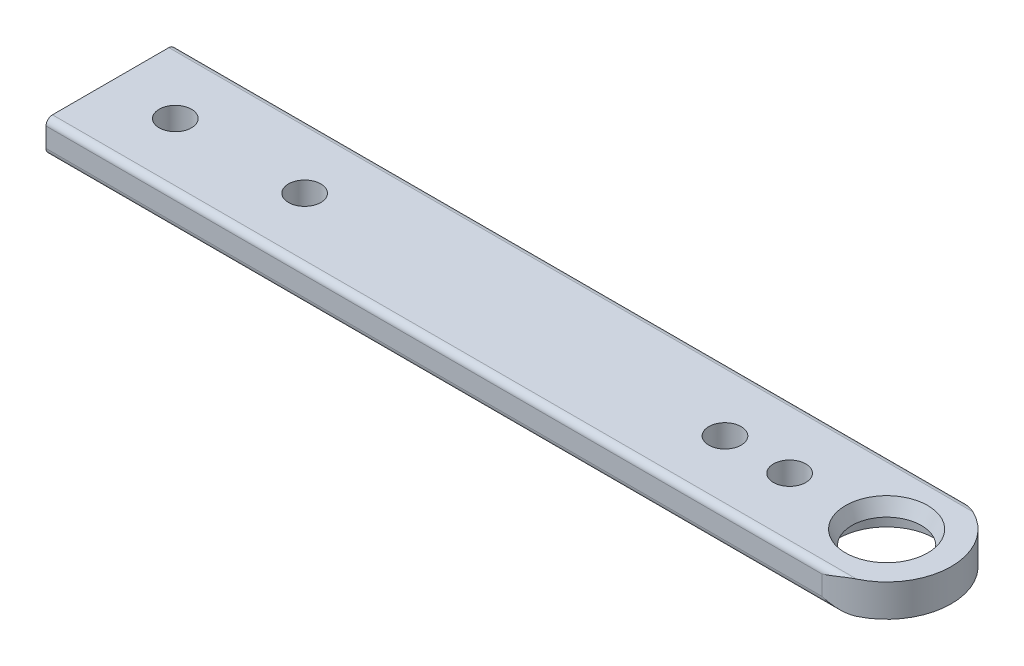
ISO-10303-21;
HEADER;
FILE_DESCRIPTION(('STEP AP214'),'2;1');
FILE_NAME('part.step','',(''),(''),'','','');
FILE_SCHEMA(('AUTOMOTIVE_DESIGN { 1 0 10303 214 1 1 1 1 }'));
ENDSEC;
DATA;
#1=APPLICATION_CONTEXT('core data for automotive mechanical design processes');
#2=APPLICATION_PROTOCOL_DEFINITION('international standard','automotive_design',2000,#1);
#3=PRODUCT_CONTEXT('',#1,'mechanical');
#4=PRODUCT('Part','Part','',(#3));
#5=PRODUCT_RELATED_PRODUCT_CATEGORY('part','',(#4));
#6=PRODUCT_DEFINITION_FORMATION('','',#4);
#7=PRODUCT_DEFINITION_CONTEXT('part definition',#1,'design');
#8=PRODUCT_DEFINITION('design','',#6,#7);
#9=PRODUCT_DEFINITION_SHAPE('','',#8);
#10=(LENGTH_UNIT() NAMED_UNIT(*) SI_UNIT(.MILLI.,.METRE.));
#11=(NAMED_UNIT(*) PLANE_ANGLE_UNIT() SI_UNIT($,.RADIAN.));
#12=(NAMED_UNIT(*) SI_UNIT($,.STERADIAN.) SOLID_ANGLE_UNIT());
#13=UNCERTAINTY_MEASURE_WITH_UNIT(LENGTH_MEASURE(1.E-05),#10,'distance_accuracy_value','');
#14=(GEOMETRIC_REPRESENTATION_CONTEXT(3) GLOBAL_UNCERTAINTY_ASSIGNED_CONTEXT((#13)) GLOBAL_UNIT_ASSIGNED_CONTEXT((#10,
#11,#12)) REPRESENTATION_CONTEXT('',''));
#15=CARTESIAN_POINT('',(0.,0.,0.));
#16=DIRECTION('',(0.,0.,1.));
#17=DIRECTION('',(1.,0.,0.));
#18=AXIS2_PLACEMENT_3D('',#15,#16,#17);
#19=CARTESIAN_POINT('',(0.,6.35,0.));
#20=DIRECTION('',(0.,1.,0.));
#21=DIRECTION('',(0.,0.,1.));
#22=AXIS2_PLACEMENT_3D('',#19,#20,#21);
#23=PLANE('',#22);
#24=CARTESIAN_POINT('',(69.85,6.35,0.));
#25=DIRECTION('',(0.,-1.,0.));
#26=DIRECTION('',(0.,0.,-1.));
#27=AXIS2_PLACEMENT_3D('',#24,#25,#26);
#28=CIRCLE('',#27,8.06821118956826);
#29=CARTESIAN_POINT('',(69.85,6.35,-8.06821118956826));
#30=VERTEX_POINT('',#29);
#31=EDGE_CURVE('E263',#30,#30,#28,.T.);
#32=ORIENTED_EDGE('',*,*,#31,.T.);
#33=EDGE_LOOP('',(#32));
#34=FACE_BOUND('',#33,.T.);
#35=CARTESIAN_POINT('',(50.8,6.35,0.));
#36=DIRECTION('',(0.,-1.,0.));
#37=DIRECTION('',(0.,0.,-1.));
#38=AXIS2_PLACEMENT_3D('',#35,#36,#37);
#39=CIRCLE('',#38,3.175);
#40=CARTESIAN_POINT('',(50.8,6.35,-3.17499999999998));
#41=VERTEX_POINT('',#40);
#42=EDGE_CURVE('E244',#41,#41,#39,.T.);
#43=ORIENTED_EDGE('',*,*,#42,.T.);
#44=EDGE_LOOP('',(#43));
#45=FACE_BOUND('',#44,.T.);
#46=CARTESIAN_POINT('',(38.1,6.35,0.));
#47=DIRECTION('',(0.,-1.,0.));
#48=DIRECTION('',(0.,0.,-1.));
#49=AXIS2_PLACEMENT_3D('',#46,#47,#48);
#50=CIRCLE('',#49,3.175);
#51=CARTESIAN_POINT('',(38.1,6.35,-3.17499999999998));
#52=VERTEX_POINT('',#51);
#53=EDGE_CURVE('E251',#52,#52,#50,.T.);
#54=ORIENTED_EDGE('',*,*,#53,.T.);
#55=EDGE_LOOP('',(#54));
#56=FACE_BOUND('',#55,.T.);
#57=CARTESIAN_POINT('',(-69.85,6.35,0.));
#58=DIRECTION('',(0.,1.,0.));
#59=DIRECTION('',(0.,0.,1.));
#60=AXIS2_PLACEMENT_3D('',#57,#58,#59);
#61=CIRCLE('',#60,3.175);
#62=CARTESIAN_POINT('',(-69.85,6.35,3.175));
#63=VERTEX_POINT('',#62);
#64=EDGE_CURVE('E209',#63,#63,#61,.T.);
#65=ORIENTED_EDGE('',*,*,#64,.F.);
#66=EDGE_LOOP('',(#65));
#67=FACE_BOUND('',#66,.T.);
#68=CARTESIAN_POINT('',(-44.45,6.35,0.));
#69=DIRECTION('',(0.,1.,0.));
#70=DIRECTION('',(0.,0.,1.));
#71=AXIS2_PLACEMENT_3D('',#68,#69,#70);
#72=CIRCLE('',#71,3.175);
#73=CARTESIAN_POINT('',(-44.45,6.35,3.175));
#74=VERTEX_POINT('',#73);
#75=EDGE_CURVE('E212',#74,#74,#72,.T.);
#76=ORIENTED_EDGE('',*,*,#75,.F.);
#77=EDGE_LOOP('',(#76));
#78=FACE_BOUND('',#77,.T.);
#79=CARTESIAN_POINT('',(69.85,6.35,0.));
#80=DIRECTION('',(0.,-1.,0.));
#81=DIRECTION('',(0.,0.,-1.));
#82=AXIS2_PLACEMENT_3D('',#79,#80,#81);
#83=CIRCLE('',#82,12.7);
#84=CARTESIAN_POINT('',(75.3858016582966,6.35,-11.43));
#85=VERTEX_POINT('',#84);
#86=CARTESIAN_POINT('',(75.3858016582967,6.35,11.43));
#87=VERTEX_POINT('',#86);
#88=EDGE_CURVE('E67',#85,#87,#83,.T.);
#89=ORIENTED_EDGE('',*,*,#88,.F.);
#90=DIRECTION('',(-1.,0.,0.));
#91=VECTOR('',#90,1.);
#92=CARTESIAN_POINT('',(-82.55,6.35,-11.43));
#93=LINE('',#92,#91);
#94=CARTESIAN_POINT('',(-82.55,6.35,-11.43));
#95=VERTEX_POINT('',#94);
#96=EDGE_CURVE('E145',#85,#95,#93,.T.);
#97=ORIENTED_EDGE('',*,*,#96,.T.);
#98=DIRECTION('',(0.,0.,1.));
#99=VECTOR('',#98,1.);
#100=CARTESIAN_POINT('',(-82.55,6.35,12.7));
#101=LINE('',#100,#99);
#102=CARTESIAN_POINT('',(-82.55,6.35,11.43));
#103=VERTEX_POINT('',#102);
#104=EDGE_CURVE('E220',#95,#103,#101,.T.);
#105=ORIENTED_EDGE('',*,*,#104,.T.);
#106=DIRECTION('',(1.,0.,0.));
#107=VECTOR('',#106,1.);
#108=CARTESIAN_POINT('',(82.55,6.35,11.43));
#109=LINE('',#108,#107);
#110=EDGE_CURVE('E141',#103,#87,#109,.T.);
#111=ORIENTED_EDGE('',*,*,#110,.T.);
#112=EDGE_LOOP('',(#89,#97,#105,#111));
#113=FACE_BOUND('',#112,.T.);
#114=ADVANCED_FACE('F45',(#34,#45,#56,#67,#78,#113),#23,.T.);
#115=CARTESIAN_POINT('',(0.,0.,0.));
#116=DIRECTION('',(0.,1.,0.));
#117=DIRECTION('',(0.,0.,1.));
#118=AXIS2_PLACEMENT_3D('',#115,#116,#117);
#119=PLANE('',#118);
#120=CARTESIAN_POINT('',(50.8,0.,0.));
#121=DIRECTION('',(0.,-1.,0.));
#122=DIRECTION('',(0.,0.,-1.));
#123=AXIS2_PLACEMENT_3D('',#120,#121,#122);
#124=CIRCLE('',#123,3.175);
#125=CARTESIAN_POINT('',(50.8,0.,-3.17499999999998));
#126=VERTEX_POINT('',#125);
#127=EDGE_CURVE('E246',#126,#126,#124,.T.);
#128=ORIENTED_EDGE('',*,*,#127,.F.);
#129=EDGE_LOOP('',(#128));
#130=FACE_BOUND('',#129,.T.);
#131=CARTESIAN_POINT('',(38.1,0.,0.));
#132=DIRECTION('',(0.,-1.,0.));
#133=DIRECTION('',(0.,0.,-1.));
#134=AXIS2_PLACEMENT_3D('',#131,#132,#133);
#135=CIRCLE('',#134,3.175);
#136=CARTESIAN_POINT('',(38.1,0.,-3.17499999999998));
#137=VERTEX_POINT('',#136);
#138=EDGE_CURVE('E258',#137,#137,#135,.T.);
#139=ORIENTED_EDGE('',*,*,#138,.F.);
#140=EDGE_LOOP('',(#139));
#141=FACE_BOUND('',#140,.T.);
#142=CARTESIAN_POINT('',(69.85,0.,0.));
#143=DIRECTION('',(0.,-1.,0.));
#144=DIRECTION('',(0.,0.,-1.));
#145=AXIS2_PLACEMENT_3D('',#142,#143,#144);
#146=CIRCLE('',#145,9.52499999999999);
#147=CARTESIAN_POINT('',(69.85,0.,-9.52499999999999));
#148=VERTEX_POINT('',#147);
#149=EDGE_CURVE('E201',#148,#148,#146,.T.);
#150=ORIENTED_EDGE('',*,*,#149,.F.);
#151=EDGE_LOOP('',(#150));
#152=FACE_BOUND('',#151,.T.);
#153=CARTESIAN_POINT('',(-69.85,0.,0.));
#154=DIRECTION('',(0.,1.,0.));
#155=DIRECTION('',(0.,0.,1.));
#156=AXIS2_PLACEMENT_3D('',#153,#154,#155);
#157=CIRCLE('',#156,3.175);
#158=CARTESIAN_POINT('',(-69.85,0.,3.175));
#159=VERTEX_POINT('',#158);
#160=EDGE_CURVE('E206',#159,#159,#157,.T.);
#161=ORIENTED_EDGE('',*,*,#160,.T.);
#162=EDGE_LOOP('',(#161));
#163=FACE_BOUND('',#162,.T.);
#164=CARTESIAN_POINT('',(-44.45,0.,0.));
#165=DIRECTION('',(0.,1.,0.));
#166=DIRECTION('',(0.,0.,1.));
#167=AXIS2_PLACEMENT_3D('',#164,#165,#166);
#168=CIRCLE('',#167,3.175);
#169=CARTESIAN_POINT('',(-44.45,0.,3.175));
#170=VERTEX_POINT('',#169);
#171=EDGE_CURVE('E215',#170,#170,#168,.T.);
#172=ORIENTED_EDGE('',*,*,#171,.T.);
#173=EDGE_LOOP('',(#172));
#174=FACE_BOUND('',#173,.T.);
#175=DIRECTION('',(-1.,0.,0.));
#176=VECTOR('',#175,1.);
#177=CARTESIAN_POINT('',(0.,0.,-11.43));
#178=LINE('',#177,#176);
#179=CARTESIAN_POINT('',(-82.55,0.,-11.43));
#180=VERTEX_POINT('',#179);
#181=CARTESIAN_POINT('',(75.3858016582966,0.,-11.43));
#182=VERTEX_POINT('',#181);
#183=EDGE_CURVE('E133',#180,#182,#178,.F.);
#184=ORIENTED_EDGE('',*,*,#183,.T.);
#185=CARTESIAN_POINT('',(69.85,0.,0.));
#186=DIRECTION('',(0.,-1.,0.));
#187=DIRECTION('',(0.,0.,-1.));
#188=AXIS2_PLACEMENT_3D('',#185,#186,#187);
#189=CIRCLE('',#188,12.7);
#190=CARTESIAN_POINT('',(75.3858016582967,0.,11.43));
#191=VERTEX_POINT('',#190);
#192=EDGE_CURVE('E117',#182,#191,#189,.T.);
#193=ORIENTED_EDGE('',*,*,#192,.T.);
#194=DIRECTION('',(1.,0.,0.));
#195=VECTOR('',#194,1.);
#196=CARTESIAN_POINT('',(0.,0.,11.43));
#197=LINE('',#196,#195);
#198=CARTESIAN_POINT('',(-82.55,0.,11.43));
#199=VERTEX_POINT('',#198);
#200=EDGE_CURVE('E142',#191,#199,#197,.F.);
#201=ORIENTED_EDGE('',*,*,#200,.T.);
#202=DIRECTION('',(0.,0.,1.));
#203=VECTOR('',#202,1.);
#204=CARTESIAN_POINT('',(-82.55,0.,12.7));
#205=LINE('',#204,#203);
#206=EDGE_CURVE('E140',#180,#199,#205,.T.);
#207=ORIENTED_EDGE('',*,*,#206,.F.);
#208=EDGE_LOOP('',(#184,#193,#201,#207));
#209=FACE_BOUND('',#208,.T.);
#210=ADVANCED_FACE('F138',(#130,#141,#152,#163,#174,#209),#119,.F.);
#211=CARTESIAN_POINT('',(82.55,1.27,-11.43));
#212=DIRECTION('',(-1.,0.,0.));
#213=DIRECTION('',(0.,0.,1.));
#214=AXIS2_PLACEMENT_3D('',#211,#212,#213);
#215=CYLINDRICAL_SURFACE('',#214,1.27);
#216=DIRECTION('',(-1.,0.,0.));
#217=VECTOR('',#216,1.);
#218=CARTESIAN_POINT('',(82.55,1.27,-12.7));
#219=LINE('',#218,#217);
#220=CARTESIAN_POINT('',(69.85,1.27,-12.7));
#221=VERTEX_POINT('',#220);
#222=CARTESIAN_POINT('',(-82.55,1.27,-12.7));
#223=VERTEX_POINT('',#222);
#224=EDGE_CURVE('E134',#221,#223,#219,.T.);
#225=ORIENTED_EDGE('',*,*,#224,.F.);
#226=CARTESIAN_POINT('',(75.3858016582966,0.,-11.43));
#227=CARTESIAN_POINT('',(75.2939523209689,1.92772555725316E-05,-11.4744872462178));
#228=CARTESIAN_POINT('',(75.2015878356906,0.00233647166316483,-11.5178520842446));
#229=CARTESIAN_POINT('',(75.0160360486509,0.0110172060336333,-11.6022601093239));
#230=CARTESIAN_POINT('',(74.9228491157849,0.0173790145875732,-11.6433042816189));
#231=CARTESIAN_POINT('',(74.7359635143713,0.0335846195538852,-11.7229545335453));
#232=CARTESIAN_POINT('',(74.642266198815,0.043421598840645,-11.7615652133737));
#233=CARTESIAN_POINT('',(74.4542909556266,0.0661496642804285,-11.8364159215431));
#234=CARTESIAN_POINT('',(74.360012958563,0.0790411228415021,-11.8726556601263));
#235=CARTESIAN_POINT('',(74.0772513758382,0.121601080213901,-11.9775055511098));
#236=CARTESIAN_POINT('',(73.8880389209196,0.155231358173089,-12.0425872895512));
#237=CARTESIAN_POINT('',(73.5081894972684,0.230699084383104,-12.1633638007161));
#238=CARTESIAN_POINT('',(73.3175516924066,0.272541784861162,-12.2190525235647));
#239=CARTESIAN_POINT('',(72.8574600440097,0.380897690265937,-12.3419061944534));
#240=CARTESIAN_POINT('',(72.5875093348422,0.450520306146318,-12.4045161650886));
#241=CARTESIAN_POINT('',(72.0464559393997,0.598263065234191,-12.5116630503131));
#242=CARTESIAN_POINT('',(71.7753530850851,0.676384491931151,-12.5561972302807));
#243=CARTESIAN_POINT('',(70.9607258242278,0.918772280089303,-12.6631822082611));
#244=CARTESIAN_POINT('',(70.4157090475464,1.09110727162133,-12.6990612591252));
#245=CARTESIAN_POINT('',(69.864326500781,1.26546958246974,-12.6999939353161));
#246=CARTESIAN_POINT('',(69.8571631781075,1.26773482439116,-12.6999999955666));
#247=CARTESIAN_POINT('',(69.85,1.27,-12.7));
#248=B_SPLINE_CURVE_WITH_KNOTS('',3,(#226,#227,#228,#229,#230,#231,#232,#233,#234,#235,#236,
#237,#238,#239,#240,#241,#242,#243,#244,#245,#246,#247),.UNSPECIFIED.,.F.,.F.,(4,2,2,2,2,2,2,2,
2,2,4),(0.,0.30609774333326,0.61206454121008,0.917434436977585,1.22284158321193,
1.83103979124338,2.43962824537106,3.29593053212367,4.15236231754342,5.86467420752005,
5.88721307019278),.UNSPECIFIED.);
#249=EDGE_CURVE('E120',#221,#182,#248,.F.);
#250=ORIENTED_EDGE('',*,*,#249,.T.);
#251=ORIENTED_EDGE('',*,*,#183,.F.);
#252=CARTESIAN_POINT('',(-82.55,1.27,-11.43));
#253=DIRECTION('',(1.,0.,0.));
#254=DIRECTION('',(0.,0.,-1.));
#255=AXIS2_PLACEMENT_3D('',#252,#253,#254);
#256=CIRCLE('',#255,1.27);
#257=EDGE_CURVE('E147',#223,#180,#256,.F.);
#258=ORIENTED_EDGE('',*,*,#257,.F.);
#259=EDGE_LOOP('',(#225,#250,#251,#258));
#260=FACE_BOUND('',#259,.T.);
#261=ADVANCED_FACE('F131',(#260),#215,.T.);
#262=CARTESIAN_POINT('',(0.,5.08,-11.43));
#263=DIRECTION('',(1.,0.,0.));
#264=DIRECTION('',(0.,0.,-1.));
#265=AXIS2_PLACEMENT_3D('',#262,#263,#264);
#266=CYLINDRICAL_SURFACE('',#265,1.27);
#267=ORIENTED_EDGE('',*,*,#96,.F.);
#268=CARTESIAN_POINT('',(75.3858016582966,6.35,-11.43));
#269=CARTESIAN_POINT('',(75.2939523209689,6.34998072274443,-11.4744872462178));
#270=CARTESIAN_POINT('',(75.2015878356907,6.34766352833684,-11.5178520842446));
#271=CARTESIAN_POINT('',(75.0160360486509,6.33898279396637,-11.6022601093239));
#272=CARTESIAN_POINT('',(74.9228491157849,6.33262098541243,-11.6433042816189));
#273=CARTESIAN_POINT('',(74.7359635143713,6.31641538044612,-11.7229545335453));
#274=CARTESIAN_POINT('',(74.642266198815,6.30657840115936,-11.7615652133737));
#275=CARTESIAN_POINT('',(74.4542909556266,6.28385033571957,-11.8364159215431));
#276=CARTESIAN_POINT('',(74.360012958563,6.2709588771585,-11.8726556601263));
#277=CARTESIAN_POINT('',(74.0772513758382,6.2283989197861,-11.9775055511098));
#278=CARTESIAN_POINT('',(73.8880389209196,6.19476864182691,-12.0425872895512));
#279=CARTESIAN_POINT('',(73.5081894972684,6.1193009156169,-12.1633638007161));
#280=CARTESIAN_POINT('',(73.3175516924066,6.07745821513884,-12.2190525235647));
#281=CARTESIAN_POINT('',(72.8574600440097,5.96910230973406,-12.3419061944534));
#282=CARTESIAN_POINT('',(72.5875093348422,5.89947969385368,-12.4045161650886));
#283=CARTESIAN_POINT('',(72.0464559393997,5.7517369347658,-12.5116630503131));
#284=CARTESIAN_POINT('',(71.7753530850851,5.67361550806883,-12.5561972302807));
#285=CARTESIAN_POINT('',(70.9607258242277,5.43122771991073,-12.6631822082611));
#286=CARTESIAN_POINT('',(70.4157090475463,5.25889272837882,-12.6990612591252));
#287=CARTESIAN_POINT('',(69.864326500781,5.08453041753026,-12.6999939353161));
#288=CARTESIAN_POINT('',(69.8571631781075,5.08226517560884,-12.6999999955666));
#289=CARTESIAN_POINT('',(69.85,5.08,-12.7));
#290=B_SPLINE_CURVE_WITH_KNOTS('',3,(#268,#269,#270,#271,#272,#273,#274,#275,#276,#277,#278,
#279,#280,#281,#282,#283,#284,#285,#286,#287,#288,#289),.UNSPECIFIED.,.F.,.F.,(4,2,2,2,2,2,2,2,
2,2,4),(0.,0.306097743333229,0.612064541210051,0.917434436977556,1.22284158321191,
1.83103979124338,2.43962824537106,3.29593053212368,4.15236231754343,5.86467420752005,
5.88721307019278),.UNSPECIFIED.);
#291=CARTESIAN_POINT('',(69.85,5.08,-12.7));
#292=VERTEX_POINT('',#291);
#293=EDGE_CURVE('E12',#85,#292,#290,.T.);
#294=ORIENTED_EDGE('',*,*,#293,.T.);
#295=DIRECTION('',(-1.,0.,0.));
#296=VECTOR('',#295,1.);
#297=CARTESIAN_POINT('',(82.55,5.08,-12.7));
#298=LINE('',#297,#296);
#299=CARTESIAN_POINT('',(-82.55,5.08,-12.7));
#300=VERTEX_POINT('',#299);
#301=EDGE_CURVE('E229',#300,#292,#298,.F.);
#302=ORIENTED_EDGE('',*,*,#301,.F.);
#303=CARTESIAN_POINT('',(-82.55,5.08,-11.43));
#304=DIRECTION('',(1.,0.,0.));
#305=DIRECTION('',(0.,0.,-1.));
#306=AXIS2_PLACEMENT_3D('',#303,#304,#305);
#307=CIRCLE('',#306,1.27);
#308=EDGE_CURVE('E236',#95,#300,#307,.F.);
#309=ORIENTED_EDGE('',*,*,#308,.F.);
#310=EDGE_LOOP('',(#267,#294,#302,#309));
#311=FACE_BOUND('',#310,.T.);
#312=ADVANCED_FACE('F184',(#311),#266,.T.);
#313=CARTESIAN_POINT('',(82.55,6.35,12.7));
#314=DIRECTION('',(0.,0.,-1.));
#315=DIRECTION('',(-1.,0.,0.));
#316=AXIS2_PLACEMENT_3D('',#313,#314,#315);
#317=PLANE('',#316);
#318=DIRECTION('',(0.,-1.,0.));
#319=VECTOR('',#318,1.);
#320=CARTESIAN_POINT('',(69.85,6.35,12.7));
#321=LINE('',#320,#319);
#322=CARTESIAN_POINT('',(69.85,5.08,12.7));
#323=VERTEX_POINT('',#322);
#324=CARTESIAN_POINT('',(69.85,1.27,12.7));
#325=VERTEX_POINT('',#324);
#326=EDGE_CURVE('E202',#323,#325,#321,.T.);
#327=ORIENTED_EDGE('',*,*,#326,.F.);
#328=DIRECTION('',(1.,0.,0.));
#329=VECTOR('',#328,1.);
#330=CARTESIAN_POINT('',(-82.55,5.08,12.7));
#331=LINE('',#330,#329);
#332=CARTESIAN_POINT('',(-82.55,5.08,12.7));
#333=VERTEX_POINT('',#332);
#334=EDGE_CURVE('E152',#323,#333,#331,.F.);
#335=ORIENTED_EDGE('',*,*,#334,.T.);
#336=DIRECTION('',(0.,-1.,0.));
#337=VECTOR('',#336,1.);
#338=CARTESIAN_POINT('',(-82.55,6.35,12.7));
#339=LINE('',#338,#337);
#340=CARTESIAN_POINT('',(-82.55,1.27,12.7));
#341=VERTEX_POINT('',#340);
#342=EDGE_CURVE('E226',#333,#341,#339,.T.);
#343=ORIENTED_EDGE('',*,*,#342,.T.);
#344=DIRECTION('',(1.,0.,0.));
#345=VECTOR('',#344,1.);
#346=CARTESIAN_POINT('',(82.55,1.27,12.7));
#347=LINE('',#346,#345);
#348=EDGE_CURVE('E154',#341,#325,#347,.T.);
#349=ORIENTED_EDGE('',*,*,#348,.T.);
#350=EDGE_LOOP('',(#327,#335,#343,#349));
#351=FACE_BOUND('',#350,.T.);
#352=ADVANCED_FACE('F189',(#351),#317,.F.);
#353=CARTESIAN_POINT('',(82.55,1.27,11.43));
#354=DIRECTION('',(1.,0.,0.));
#355=DIRECTION('',(0.,0.,-1.));
#356=AXIS2_PLACEMENT_3D('',#353,#354,#355);
#357=CYLINDRICAL_SURFACE('',#356,1.27);
#358=ORIENTED_EDGE('',*,*,#200,.F.);
#359=CARTESIAN_POINT('',(75.3858016582967,0.,11.43));
#360=CARTESIAN_POINT('',(75.2939523209684,1.92772555739418E-05,11.4744872462181));
#361=CARTESIAN_POINT('',(75.2015878356895,0.00233647166319452,11.5178520842451));
#362=CARTESIAN_POINT('',(75.0160360486486,0.0110172060337673,11.6022601093249));
#363=CARTESIAN_POINT('',(74.922849115782,0.017379014587784,11.6433042816202));
#364=CARTESIAN_POINT('',(74.7359635143673,0.0335846195542791,11.722954533547));
#365=CARTESIAN_POINT('',(74.6422661988105,0.0434215988411402,11.7615652133755));
#366=CARTESIAN_POINT('',(74.4542909556212,0.0661496642811411,11.8364159215452));
#367=CARTESIAN_POINT('',(74.3600129585571,0.0790411228423308,11.8726556601285));
#368=CARTESIAN_POINT('',(74.077251375833,0.121601080214831,11.9775055511116));
#369=CARTESIAN_POINT('',(73.8880389209155,0.155231358173954,12.0425872895525));
#370=CARTESIAN_POINT('',(73.5081894972665,0.230699084383471,12.1633638007167));
#371=CARTESIAN_POINT('',(73.3175516924055,0.272541784861104,12.2190525235649));
#372=CARTESIAN_POINT('',(72.85746004401,0.380897690266325,12.3419061944533));
#373=CARTESIAN_POINT('',(72.5875093348431,0.450520306148113,12.4045161650886));
#374=CARTESIAN_POINT('',(72.0464559394,0.598263065232104,12.511663050313));
#375=CARTESIAN_POINT('',(71.7753530850841,0.676384491923765,12.5561972302805));
#376=CARTESIAN_POINT('',(70.9607258242333,0.918772280103098,12.6631822082611));
#377=CARTESIAN_POINT('',(70.4157090475713,1.09110727169831,12.6990612591254));
#378=CARTESIAN_POINT('',(69.8643265007816,1.26546958247177,12.6999939353161));
#379=CARTESIAN_POINT('',(69.8571631781078,1.26773482439218,12.6999999955666));
#380=CARTESIAN_POINT('',(69.85,1.27,12.7));
#381=B_SPLINE_CURVE_WITH_KNOTS('',3,(#359,#360,#361,#362,#363,#364,#365,#366,#367,#368,#369,
#370,#371,#372,#373,#374,#375,#376,#377,#378,#379,#380),.UNSPECIFIED.,.F.,.F.,(4,2,2,2,2,2,2,2,
2,2,4),(0.,0.306097743335167,0.612064541213954,0.917434436982982,1.22284158321883,
1.8310397912466,2.43962824537104,3.29593053212321,4.15236231754171,5.86467420752011,
5.88721307019281),.UNSPECIFIED.);
#382=EDGE_CURVE('E123',#191,#325,#381,.T.);
#383=ORIENTED_EDGE('',*,*,#382,.T.);
#384=ORIENTED_EDGE('',*,*,#348,.F.);
#385=CARTESIAN_POINT('',(-82.55,1.27,11.43));
#386=DIRECTION('',(1.,0.,0.));
#387=DIRECTION('',(0.,0.,-1.));
#388=AXIS2_PLACEMENT_3D('',#385,#386,#387);
#389=CIRCLE('',#388,1.27);
#390=EDGE_CURVE('E234',#199,#341,#389,.F.);
#391=ORIENTED_EDGE('',*,*,#390,.F.);
#392=EDGE_LOOP('',(#358,#383,#384,#391));
#393=FACE_BOUND('',#392,.T.);
#394=ADVANCED_FACE('F191',(#393),#357,.T.);
#395=CARTESIAN_POINT('',(0.,5.08,11.43));
#396=DIRECTION('',(-1.,0.,0.));
#397=DIRECTION('',(0.,0.,1.));
#398=AXIS2_PLACEMENT_3D('',#395,#396,#397);
#399=CYLINDRICAL_SURFACE('',#398,1.27);
#400=ORIENTED_EDGE('',*,*,#334,.F.);
#401=CARTESIAN_POINT('',(75.3858016582967,6.35,11.43));
#402=CARTESIAN_POINT('',(75.2939523209684,6.34998072274443,11.4744872462181));
#403=CARTESIAN_POINT('',(75.2015878356895,6.3476635283368,11.5178520842451));
#404=CARTESIAN_POINT('',(75.0160360486486,6.33898279396623,11.6022601093249));
#405=CARTESIAN_POINT('',(74.922849115782,6.33262098541222,11.6433042816202));
#406=CARTESIAN_POINT('',(74.7359635143673,6.31641538044572,11.722954533547));
#407=CARTESIAN_POINT('',(74.6422661988105,6.30657840115886,11.7615652133755));
#408=CARTESIAN_POINT('',(74.4542909556212,6.28385033571886,11.8364159215452));
#409=CARTESIAN_POINT('',(74.3600129585571,6.27095887715767,11.8726556601285));
#410=CARTESIAN_POINT('',(74.077251375833,6.22839891978517,11.9775055511116));
#411=CARTESIAN_POINT('',(73.8880389209155,6.19476864182605,12.0425872895525));
#412=CARTESIAN_POINT('',(73.5081894972665,6.11930091561653,12.1633638007167));
#413=CARTESIAN_POINT('',(73.3175516924055,6.0774582151389,12.2190525235649));
#414=CARTESIAN_POINT('',(72.85746004401,5.96910230973367,12.3419061944533));
#415=CARTESIAN_POINT('',(72.5875093348431,5.89947969385189,12.4045161650886));
#416=CARTESIAN_POINT('',(72.0464559394,5.75173693476789,12.511663050313));
#417=CARTESIAN_POINT('',(71.7753530850841,5.67361550807622,12.5561972302805));
#418=CARTESIAN_POINT('',(70.9607258242333,5.43122771989692,12.6631822082611));
#419=CARTESIAN_POINT('',(70.4157090475713,5.25889272830178,12.6990612591254));
#420=CARTESIAN_POINT('',(69.8643265007816,5.08453041752823,12.6999939353161));
#421=CARTESIAN_POINT('',(69.8571631781078,5.08226517560782,12.6999999955666));
#422=CARTESIAN_POINT('',(69.85,5.08,12.7));
#423=B_SPLINE_CURVE_WITH_KNOTS('',3,(#401,#402,#403,#404,#405,#406,#407,#408,#409,#410,#411,
#412,#413,#414,#415,#416,#417,#418,#419,#420,#421,#422),.UNSPECIFIED.,.F.,.F.,(4,2,2,2,2,2,2,2,
2,2,4),(0.,0.306097743335167,0.612064541213938,0.917434436982966,1.22284158321882,
1.83103979124658,2.43962824537104,3.29593053212321,4.15236231754172,5.86467420752011,
5.88721307019281),.UNSPECIFIED.);
#424=EDGE_CURVE('E60',#323,#87,#423,.F.);
#425=ORIENTED_EDGE('',*,*,#424,.T.);
#426=ORIENTED_EDGE('',*,*,#110,.F.);
#427=CARTESIAN_POINT('',(-82.55,5.08,11.43));
#428=DIRECTION('',(1.,0.,0.));
#429=DIRECTION('',(0.,0.,-1.));
#430=AXIS2_PLACEMENT_3D('',#427,#428,#429);
#431=CIRCLE('',#430,1.27);
#432=EDGE_CURVE('E75',#333,#103,#431,.F.);
#433=ORIENTED_EDGE('',*,*,#432,.F.);
#434=EDGE_LOOP('',(#400,#425,#426,#433));
#435=FACE_BOUND('',#434,.T.);
#436=ADVANCED_FACE('F47',(#435),#399,.T.);
#437=CARTESIAN_POINT('',(-82.55,6.35,12.7));
#438=DIRECTION('',(1.,0.,0.));
#439=DIRECTION('',(0.,0.,-1.));
#440=AXIS2_PLACEMENT_3D('',#437,#438,#439);
#441=PLANE('',#440);
#442=DIRECTION('',(0.,-1.,0.));
#443=VECTOR('',#442,1.);
#444=CARTESIAN_POINT('',(-82.55,6.35,-12.7));
#445=LINE('',#444,#443);
#446=EDGE_CURVE('E222',#300,#223,#445,.T.);
#447=ORIENTED_EDGE('',*,*,#446,.T.);
#448=ORIENTED_EDGE('',*,*,#257,.T.);
#449=ORIENTED_EDGE('',*,*,#206,.T.);
#450=ORIENTED_EDGE('',*,*,#390,.T.);
#451=ORIENTED_EDGE('',*,*,#342,.F.);
#452=ORIENTED_EDGE('',*,*,#432,.T.);
#453=ORIENTED_EDGE('',*,*,#104,.F.);
#454=ORIENTED_EDGE('',*,*,#308,.T.);
#455=EDGE_LOOP('',(#447,#448,#449,#450,#451,#452,#453,#454));
#456=FACE_BOUND('',#455,.T.);
#457=ADVANCED_FACE('F185',(#456),#441,.F.);
#458=CARTESIAN_POINT('',(82.55,6.35,-12.7));
#459=DIRECTION('',(0.,0.,1.));
#460=DIRECTION('',(1.,0.,0.));
#461=AXIS2_PLACEMENT_3D('',#458,#459,#460);
#462=PLANE('',#461);
#463=ORIENTED_EDGE('',*,*,#301,.T.);
#464=DIRECTION('',(0.,-1.,0.));
#465=VECTOR('',#464,1.);
#466=CARTESIAN_POINT('',(69.85,6.35,-12.7));
#467=LINE('',#466,#465);
#468=EDGE_CURVE('E135',#292,#221,#467,.T.);
#469=ORIENTED_EDGE('',*,*,#468,.T.);
#470=ORIENTED_EDGE('',*,*,#224,.T.);
#471=ORIENTED_EDGE('',*,*,#446,.F.);
#472=EDGE_LOOP('',(#463,#469,#470,#471));
#473=FACE_BOUND('',#472,.T.);
#474=ADVANCED_FACE('F242',(#473),#462,.F.);
#475=CARTESIAN_POINT('',(-44.45,0.,0.));
#476=DIRECTION('',(0.,1.,0.));
#477=DIRECTION('',(0.,0.,1.));
#478=AXIS2_PLACEMENT_3D('',#475,#476,#477);
#479=CYLINDRICAL_SURFACE('',#478,3.175);
#480=ORIENTED_EDGE('',*,*,#171,.F.);
#481=EDGE_LOOP('',(#480));
#482=FACE_BOUND('',#481,.T.);
#483=ORIENTED_EDGE('',*,*,#75,.T.);
#484=EDGE_LOOP('',(#483));
#485=FACE_BOUND('',#484,.T.);
#486=ADVANCED_FACE('F286',(#482,#485),#479,.F.);
#487=CARTESIAN_POINT('',(-69.85,0.,0.));
#488=DIRECTION('',(0.,1.,0.));
#489=DIRECTION('',(0.,0.,1.));
#490=AXIS2_PLACEMENT_3D('',#487,#488,#489);
#491=CYLINDRICAL_SURFACE('',#490,3.175);
#492=ORIENTED_EDGE('',*,*,#64,.T.);
#493=EDGE_LOOP('',(#492));
#494=FACE_BOUND('',#493,.T.);
#495=ORIENTED_EDGE('',*,*,#160,.F.);
#496=EDGE_LOOP('',(#495));
#497=FACE_BOUND('',#496,.T.);
#498=ADVANCED_FACE('F317',(#494,#497),#491,.F.);
#499=CARTESIAN_POINT('',(69.85,3.571875,0.));
#500=DIRECTION('',(0.,-1.,0.));
#501=DIRECTION('',(0.,0.,-1.));
#502=AXIS2_PLACEMENT_3D('',#499,#500,#501);
#503=PLANE('',#502);
#504=CARTESIAN_POINT('',(69.85,3.571875,0.));
#505=DIRECTION('',(0.,-1.,0.));
#506=DIRECTION('',(0.,0.,-1.));
#507=AXIS2_PLACEMENT_3D('',#504,#505,#506);
#508=CIRCLE('',#507,6.8313102481955);
#509=CARTESIAN_POINT('',(69.85,3.571875,-6.8313102481955));
#510=VERTEX_POINT('',#509);
#511=EDGE_CURVE('E254',#510,#510,#508,.T.);
#512=ORIENTED_EDGE('',*,*,#511,.F.);
#513=EDGE_LOOP('',(#512));
#514=FACE_BOUND('',#513,.T.);
#515=CARTESIAN_POINT('',(69.85,3.571875,0.));
#516=DIRECTION('',(0.,-1.,0.));
#517=DIRECTION('',(0.,0.,-1.));
#518=AXIS2_PLACEMENT_3D('',#515,#516,#517);
#519=CIRCLE('',#518,9.52499999999999);
#520=CARTESIAN_POINT('',(69.85,3.571875,-9.52499999999999));
#521=VERTEX_POINT('',#520);
#522=EDGE_CURVE('E203',#521,#521,#519,.T.);
#523=ORIENTED_EDGE('',*,*,#522,.T.);
#524=EDGE_LOOP('',(#523));
#525=FACE_BOUND('',#524,.T.);
#526=ADVANCED_FACE('F167',(#514,#525),#503,.T.);
#527=CARTESIAN_POINT('',(69.85,3.571875,0.));
#528=DIRECTION('',(0.,-1.,0.));
#529=DIRECTION('',(0.,0.,-1.));
#530=AXIS2_PLACEMENT_3D('',#527,#528,#529);
#531=CYLINDRICAL_SURFACE('',#530,9.52499999999999);
#532=ORIENTED_EDGE('',*,*,#522,.F.);
#533=EDGE_LOOP('',(#532));
#534=FACE_BOUND('',#533,.T.);
#535=ORIENTED_EDGE('',*,*,#149,.T.);
#536=EDGE_LOOP('',(#535));
#537=FACE_BOUND('',#536,.T.);
#538=ADVANCED_FACE('F165',(#534,#537),#531,.F.);
#539=CARTESIAN_POINT('',(69.85,6.35,0.));
#540=DIRECTION('',(0.,-1.,0.));
#541=DIRECTION('',(0.,0.,-1.));
#542=AXIS2_PLACEMENT_3D('',#539,#540,#541);
#543=CYLINDRICAL_SURFACE('',#542,12.7);
#544=ORIENTED_EDGE('',*,*,#192,.F.);
#545=ORIENTED_EDGE('',*,*,#249,.F.);
#546=ORIENTED_EDGE('',*,*,#468,.F.);
#547=ORIENTED_EDGE('',*,*,#293,.F.);
#548=ORIENTED_EDGE('',*,*,#88,.T.);
#549=ORIENTED_EDGE('',*,*,#424,.F.);
#550=ORIENTED_EDGE('',*,*,#326,.T.);
#551=ORIENTED_EDGE('',*,*,#382,.F.);
#552=EDGE_LOOP('',(#544,#545,#546,#547,#548,#549,#550,#551));
#553=FACE_BOUND('',#552,.T.);
#554=ADVANCED_FACE('F119',(#553),#543,.T.);
#555=CARTESIAN_POINT('',(38.1,6.35,0.));
#556=DIRECTION('',(0.,-1.,0.));
#557=DIRECTION('',(0.,0.,-1.));
#558=AXIS2_PLACEMENT_3D('',#555,#556,#557);
#559=CYLINDRICAL_SURFACE('',#558,3.175);
#560=ORIENTED_EDGE('',*,*,#53,.F.);
#561=EDGE_LOOP('',(#560));
#562=FACE_BOUND('',#561,.T.);
#563=ORIENTED_EDGE('',*,*,#138,.T.);
#564=EDGE_LOOP('',(#563));
#565=FACE_BOUND('',#564,.T.);
#566=ADVANCED_FACE('F164',(#562,#565),#559,.F.);
#567=CARTESIAN_POINT('',(50.8,6.35,0.));
#568=DIRECTION('',(0.,-1.,0.));
#569=DIRECTION('',(0.,0.,-1.));
#570=AXIS2_PLACEMENT_3D('',#567,#568,#569);
#571=CYLINDRICAL_SURFACE('',#570,3.175);
#572=ORIENTED_EDGE('',*,*,#42,.F.);
#573=EDGE_LOOP('',(#572));
#574=FACE_BOUND('',#573,.T.);
#575=ORIENTED_EDGE('',*,*,#127,.T.);
#576=EDGE_LOOP('',(#575));
#577=FACE_BOUND('',#576,.T.);
#578=ADVANCED_FACE('F272',(#574,#577),#571,.F.);
#579=CARTESIAN_POINT('',(69.85,6.35,0.));
#580=DIRECTION('',(0.,1.,0.));
#581=DIRECTION('',(0.,0.,1.));
#582=AXIS2_PLACEMENT_3D('',#579,#580,#581);
#583=CONICAL_SURFACE('',#582,8.06821118956826,0.418879020478632);
#584=ORIENTED_EDGE('',*,*,#511,.T.);
#585=EDGE_LOOP('',(#584));
#586=FACE_BOUND('',#585,.T.);
#587=ORIENTED_EDGE('',*,*,#31,.F.);
#588=EDGE_LOOP('',(#587));
#589=FACE_BOUND('',#588,.T.);
#590=ADVANCED_FACE('F270',(#586,#589),#583,.F.);
#591=CLOSED_SHELL('',(#114,#210,#261,#312,#352,#394,#436,#457,#474,#486,#498,#526,#538,#554,
#566,#578,#590));
#592=MANIFOLD_SOLID_BREP('B2',#591);
#593=ADVANCED_BREP_SHAPE_REPRESENTATION('',(#18,#592),#14);
#594=SHAPE_DEFINITION_REPRESENTATION(#9,#593);
ENDSEC;
END-ISO-10303-21;
